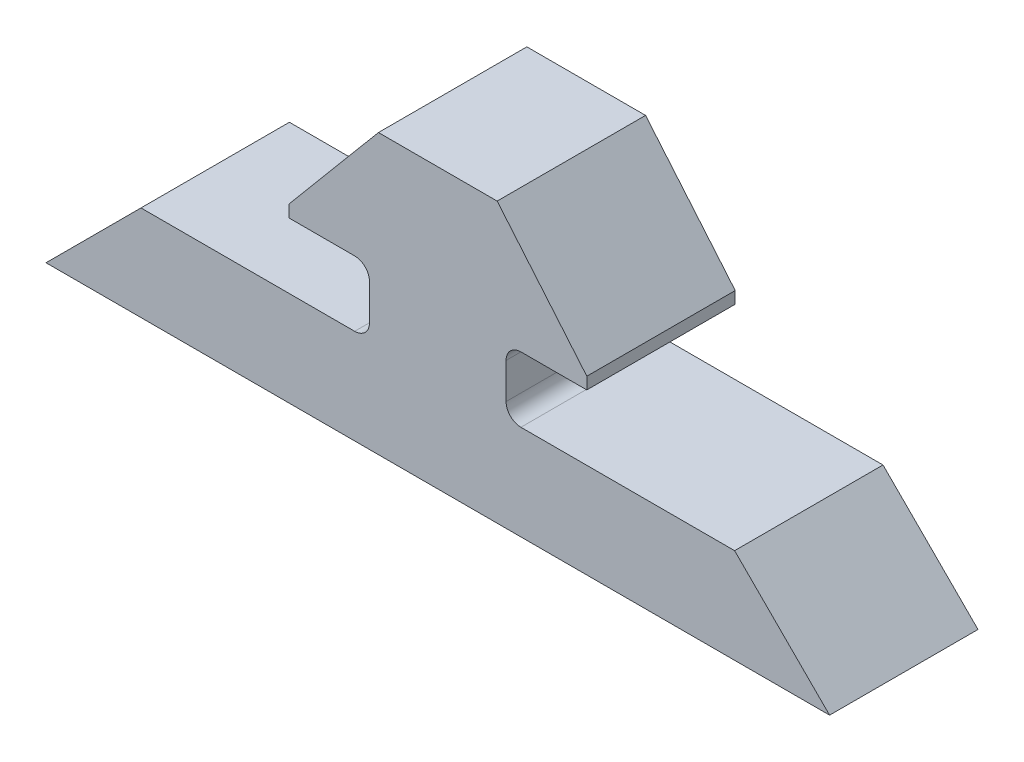
ISO-10303-21;
HEADER;
FILE_DESCRIPTION(('STEP AP214'),'2;1');
FILE_NAME('part.step','',(''),(''),'','','');
FILE_SCHEMA(('AUTOMOTIVE_DESIGN { 1 0 10303 214 1 1 1 1 }'));
ENDSEC;
DATA;
#1=APPLICATION_CONTEXT('core data for automotive mechanical design processes');
#2=APPLICATION_PROTOCOL_DEFINITION('international standard','automotive_design',2000,#1);
#3=PRODUCT_CONTEXT('',#1,'mechanical');
#4=PRODUCT('Part','Part','',(#3));
#5=PRODUCT_RELATED_PRODUCT_CATEGORY('part','',(#4));
#6=PRODUCT_DEFINITION_FORMATION('','',#4);
#7=PRODUCT_DEFINITION_CONTEXT('part definition',#1,'design');
#8=PRODUCT_DEFINITION('design','',#6,#7);
#9=PRODUCT_DEFINITION_SHAPE('','',#8);
#10=(LENGTH_UNIT() NAMED_UNIT(*) SI_UNIT(.MILLI.,.METRE.));
#11=(NAMED_UNIT(*) PLANE_ANGLE_UNIT() SI_UNIT($,.RADIAN.));
#12=(NAMED_UNIT(*) SI_UNIT($,.STERADIAN.) SOLID_ANGLE_UNIT());
#13=UNCERTAINTY_MEASURE_WITH_UNIT(LENGTH_MEASURE(1.E-05),#10,'distance_accuracy_value','');
#14=(GEOMETRIC_REPRESENTATION_CONTEXT(3) GLOBAL_UNCERTAINTY_ASSIGNED_CONTEXT((#13)) GLOBAL_UNIT_ASSIGNED_CONTEXT((#10,
#11,#12)) REPRESENTATION_CONTEXT('',''));
#15=CARTESIAN_POINT('',(0.,0.,0.));
#16=DIRECTION('',(0.,0.,1.));
#17=DIRECTION('',(1.,0.,0.));
#18=AXIS2_PLACEMENT_3D('',#15,#16,#17);
#19=CARTESIAN_POINT('',(-12.7,4.064,-3689.35));
#20=DIRECTION('',(0.707106781186539,-0.707106781186556,0.));
#21=DIRECTION('',(0.707106781186556,0.707106781186539,0.));
#22=AXIS2_PLACEMENT_3D('',#19,#20,#21);
#23=PLANE('',#22);
#24=DIRECTION('',(0.707106781186556,0.707106781186539,0.));
#25=VECTOR('',#24,1.);
#26=CARTESIAN_POINT('',(-12.7,4.064,-3683.));
#27=LINE('',#26,#25);
#28=CARTESIAN_POINT('',(-16.7640000000001,0.,-3683.));
#29=VERTEX_POINT('',#28);
#30=CARTESIAN_POINT('',(-12.7,4.064,-3683.));
#31=VERTEX_POINT('',#30);
#32=EDGE_CURVE('E190',#29,#31,#27,.T.);
#33=ORIENTED_EDGE('',*,*,#32,.T.);
#34=DIRECTION('',(0.,0.,1.));
#35=VECTOR('',#34,1.);
#36=CARTESIAN_POINT('',(-12.7,4.064,-3689.35));
#37=LINE('',#36,#35);
#38=CARTESIAN_POINT('',(-12.7,4.064,-3689.35));
#39=VERTEX_POINT('',#38);
#40=EDGE_CURVE('E11',#39,#31,#37,.T.);
#41=ORIENTED_EDGE('',*,*,#40,.F.);
#42=DIRECTION('',(0.707106781186556,0.707106781186539,0.));
#43=VECTOR('',#42,1.);
#44=CARTESIAN_POINT('',(-12.7,4.064,-3689.35));
#45=LINE('',#44,#43);
#46=CARTESIAN_POINT('',(-16.7640000000001,0.,-3689.35));
#47=VERTEX_POINT('',#46);
#48=EDGE_CURVE('E225',#47,#39,#45,.T.);
#49=ORIENTED_EDGE('',*,*,#48,.F.);
#50=DIRECTION('',(0.,0.,1.));
#51=VECTOR('',#50,1.);
#52=CARTESIAN_POINT('',(-16.7640000000001,0.,-3689.35));
#53=LINE('',#52,#51);
#54=EDGE_CURVE('E186',#47,#29,#53,.T.);
#55=ORIENTED_EDGE('',*,*,#54,.T.);
#56=EDGE_LOOP('',(#33,#41,#49,#55));
#57=FACE_BOUND('',#56,.T.);
#58=ADVANCED_FACE('F33',(#57),#23,.F.);
#59=CARTESIAN_POINT('',(-12.7,4.064,-3689.35));
#60=DIRECTION('',(0.,-1.,0.));
#61=DIRECTION('',(0.,0.,-1.));
#62=AXIS2_PLACEMENT_3D('',#59,#60,#61);
#63=PLANE('',#62);
#64=DIRECTION('',(1.,0.,0.));
#65=VECTOR('',#64,1.);
#66=CARTESIAN_POINT('',(-12.7,4.064,-3683.));
#67=LINE('',#66,#65);
#68=CARTESIAN_POINT('',(-3.55599999999985,4.064,-3683.));
#69=VERTEX_POINT('',#68);
#70=EDGE_CURVE('E193',#31,#69,#67,.T.);
#71=ORIENTED_EDGE('',*,*,#70,.T.);
#72=DIRECTION('',(0.,0.,1.));
#73=VECTOR('',#72,1.);
#74=CARTESIAN_POINT('',(-3.55599999999985,4.064,-3689.35));
#75=LINE('',#74,#73);
#76=CARTESIAN_POINT('',(-3.55599999999985,4.064,-3689.35));
#77=VERTEX_POINT('',#76);
#78=EDGE_CURVE('E41',#77,#69,#75,.T.);
#79=ORIENTED_EDGE('',*,*,#78,.F.);
#80=DIRECTION('',(1.,0.,0.));
#81=VECTOR('',#80,1.);
#82=CARTESIAN_POINT('',(-12.7,4.064,-3689.35));
#83=LINE('',#82,#81);
#84=EDGE_CURVE('E120',#39,#77,#83,.T.);
#85=ORIENTED_EDGE('',*,*,#84,.F.);
#86=ORIENTED_EDGE('',*,*,#40,.T.);
#87=EDGE_LOOP('',(#71,#79,#85,#86));
#88=FACE_BOUND('',#87,.T.);
#89=ADVANCED_FACE('F323',(#88),#63,.F.);
#90=CARTESIAN_POINT('',(-3.55599999999985,4.69899999999985,-3689.35));
#91=DIRECTION('',(0.,0.,1.));
#92=DIRECTION('',(1.,0.,0.));
#93=AXIS2_PLACEMENT_3D('',#90,#91,#92);
#94=CYLINDRICAL_SURFACE('',#93,0.634999999999851);
#95=CARTESIAN_POINT('',(-3.55599999999985,4.69899999999985,-3683.));
#96=DIRECTION('',(0.,0.,1.));
#97=DIRECTION('',(1.,0.,0.));
#98=AXIS2_PLACEMENT_3D('',#95,#96,#97);
#99=CIRCLE('',#98,0.634999999999851);
#100=CARTESIAN_POINT('',(-2.921,4.69899999999985,-3683.));
#101=VERTEX_POINT('',#100);
#102=EDGE_CURVE('E195',#69,#101,#99,.T.);
#103=ORIENTED_EDGE('',*,*,#102,.T.);
#104=DIRECTION('',(0.,0.,1.));
#105=VECTOR('',#104,1.);
#106=CARTESIAN_POINT('',(-2.921,4.69899999999985,-3689.35));
#107=LINE('',#106,#105);
#108=CARTESIAN_POINT('',(-2.921,4.69899999999985,-3689.35));
#109=VERTEX_POINT('',#108);
#110=EDGE_CURVE('E262',#109,#101,#107,.T.);
#111=ORIENTED_EDGE('',*,*,#110,.F.);
#112=CARTESIAN_POINT('',(-3.55599999999985,4.69899999999985,-3689.35));
#113=DIRECTION('',(0.,0.,1.));
#114=DIRECTION('',(1.,0.,0.));
#115=AXIS2_PLACEMENT_3D('',#112,#113,#114);
#116=CIRCLE('',#115,0.634999999999851);
#117=EDGE_CURVE('E270',#77,#109,#116,.T.);
#118=ORIENTED_EDGE('',*,*,#117,.F.);
#119=ORIENTED_EDGE('',*,*,#78,.T.);
#120=EDGE_LOOP('',(#103,#111,#118,#119));
#121=FACE_BOUND('',#120,.T.);
#122=ADVANCED_FACE('F268',(#121),#94,.F.);
#123=CARTESIAN_POINT('',(-2.92099999999999,4.69899999999985,-3689.35));
#124=DIRECTION('',(1.,0.,0.));
#125=DIRECTION('',(0.,1.,0.));
#126=AXIS2_PLACEMENT_3D('',#123,#124,#125);
#127=PLANE('',#126);
#128=DIRECTION('',(0.,1.,0.));
#129=VECTOR('',#128,1.);
#130=CARTESIAN_POINT('',(-2.92099999999999,4.69899999999985,-3683.));
#131=LINE('',#130,#129);
#132=CARTESIAN_POINT('',(-2.921,6.22300000000015,-3683.));
#133=VERTEX_POINT('',#132);
#134=EDGE_CURVE('E197',#101,#133,#131,.T.);
#135=ORIENTED_EDGE('',*,*,#134,.T.);
#136=DIRECTION('',(0.,0.,1.));
#137=VECTOR('',#136,1.);
#138=CARTESIAN_POINT('',(-2.921,6.22300000000015,-3689.35));
#139=LINE('',#138,#137);
#140=CARTESIAN_POINT('',(-2.921,6.22300000000015,-3689.35));
#141=VERTEX_POINT('',#140);
#142=EDGE_CURVE('E259',#141,#133,#139,.T.);
#143=ORIENTED_EDGE('',*,*,#142,.F.);
#144=DIRECTION('',(0.,1.,0.));
#145=VECTOR('',#144,1.);
#146=CARTESIAN_POINT('',(-2.92099999999999,4.69899999999985,-3689.35));
#147=LINE('',#146,#145);
#148=EDGE_CURVE('E286',#109,#141,#147,.T.);
#149=ORIENTED_EDGE('',*,*,#148,.F.);
#150=ORIENTED_EDGE('',*,*,#110,.T.);
#151=EDGE_LOOP('',(#135,#143,#149,#150));
#152=FACE_BOUND('',#151,.T.);
#153=ADVANCED_FACE('F277',(#152),#127,.F.);
#154=CARTESIAN_POINT('',(-3.55599999999985,6.22300000000015,-3689.35));
#155=DIRECTION('',(0.,0.,1.));
#156=DIRECTION('',(1.,0.,0.));
#157=AXIS2_PLACEMENT_3D('',#154,#155,#156);
#158=CYLINDRICAL_SURFACE('',#157,0.634999999999851);
#159=CARTESIAN_POINT('',(-3.55599999999985,6.22300000000015,-3683.));
#160=DIRECTION('',(0.,0.,1.));
#161=DIRECTION('',(1.,0.,0.));
#162=AXIS2_PLACEMENT_3D('',#159,#160,#161);
#163=CIRCLE('',#162,0.634999999999851);
#164=CARTESIAN_POINT('',(-3.55599999999985,6.858,-3683.));
#165=VERTEX_POINT('',#164);
#166=EDGE_CURVE('E199',#133,#165,#163,.T.);
#167=ORIENTED_EDGE('',*,*,#166,.T.);
#168=DIRECTION('',(0.,0.,1.));
#169=VECTOR('',#168,1.);
#170=CARTESIAN_POINT('',(-3.55599999999985,6.858,-3689.35));
#171=LINE('',#170,#169);
#172=CARTESIAN_POINT('',(-3.55599999999985,6.858,-3689.35));
#173=VERTEX_POINT('',#172);
#174=EDGE_CURVE('E256',#173,#165,#171,.T.);
#175=ORIENTED_EDGE('',*,*,#174,.F.);
#176=CARTESIAN_POINT('',(-3.55599999999985,6.22300000000015,-3689.35));
#177=DIRECTION('',(0.,0.,1.));
#178=DIRECTION('',(1.,0.,0.));
#179=AXIS2_PLACEMENT_3D('',#176,#177,#178);
#180=CIRCLE('',#179,0.634999999999851);
#181=EDGE_CURVE('E283',#141,#173,#180,.T.);
#182=ORIENTED_EDGE('',*,*,#181,.F.);
#183=ORIENTED_EDGE('',*,*,#142,.T.);
#184=EDGE_LOOP('',(#167,#175,#182,#183));
#185=FACE_BOUND('',#184,.T.);
#186=ADVANCED_FACE('F281',(#185),#158,.F.);
#187=CARTESIAN_POINT('',(-3.55599999999985,6.85800000000001,-3689.35));
#188=DIRECTION('',(0.,1.,0.));
#189=DIRECTION('',(-1.,0.,0.));
#190=AXIS2_PLACEMENT_3D('',#187,#188,#189);
#191=PLANE('',#190);
#192=DIRECTION('',(-1.,0.,0.));
#193=VECTOR('',#192,1.);
#194=CARTESIAN_POINT('',(-3.55599999999985,6.85800000000001,-3683.));
#195=LINE('',#194,#193);
#196=CARTESIAN_POINT('',(-6.376363549,6.858,-3683.));
#197=VERTEX_POINT('',#196);
#198=EDGE_CURVE('E201',#165,#197,#195,.T.);
#199=ORIENTED_EDGE('',*,*,#198,.T.);
#200=DIRECTION('',(0.,0.,1.));
#201=VECTOR('',#200,1.);
#202=CARTESIAN_POINT('',(-6.376363549,6.858,-3689.35));
#203=LINE('',#202,#201);
#204=CARTESIAN_POINT('',(-6.376363549,6.858,-3689.35));
#205=VERTEX_POINT('',#204);
#206=EDGE_CURVE('E253',#205,#197,#203,.T.);
#207=ORIENTED_EDGE('',*,*,#206,.F.);
#208=DIRECTION('',(-1.,0.,0.));
#209=VECTOR('',#208,1.);
#210=CARTESIAN_POINT('',(-3.55599999999985,6.85800000000001,-3689.35));
#211=LINE('',#210,#209);
#212=EDGE_CURVE('E285',#173,#205,#211,.T.);
#213=ORIENTED_EDGE('',*,*,#212,.F.);
#214=ORIENTED_EDGE('',*,*,#174,.T.);
#215=EDGE_LOOP('',(#199,#207,#213,#214));
#216=FACE_BOUND('',#215,.T.);
#217=ADVANCED_FACE('F335',(#216),#191,.F.);
#218=CARTESIAN_POINT('',(-6.376363549,6.858,-3689.35));
#219=DIRECTION('',(1.,0.,0.));
#220=DIRECTION('',(0.,0.,-1.));
#221=AXIS2_PLACEMENT_3D('',#218,#219,#220);
#222=PLANE('',#221);
#223=DIRECTION('',(0.,1.,0.));
#224=VECTOR('',#223,1.);
#225=CARTESIAN_POINT('',(-6.376363549,6.858,-3683.));
#226=LINE('',#225,#224);
#227=CARTESIAN_POINT('',(-6.376363549,7.36599995798179,-3683.));
#228=VERTEX_POINT('',#227);
#229=EDGE_CURVE('E203',#197,#228,#226,.T.);
#230=ORIENTED_EDGE('',*,*,#229,.T.);
#231=DIRECTION('',(0.,0.,1.));
#232=VECTOR('',#231,1.);
#233=CARTESIAN_POINT('',(-6.376363549,7.36599995798179,-3689.35));
#234=LINE('',#233,#232);
#235=CARTESIAN_POINT('',(-6.376363549,7.36599995798179,-3689.35));
#236=VERTEX_POINT('',#235);
#237=EDGE_CURVE('E250',#236,#228,#234,.T.);
#238=ORIENTED_EDGE('',*,*,#237,.F.);
#239=DIRECTION('',(0.,1.,0.));
#240=VECTOR('',#239,1.);
#241=CARTESIAN_POINT('',(-6.376363549,6.858,-3689.35));
#242=LINE('',#241,#240);
#243=EDGE_CURVE('E288',#205,#236,#242,.T.);
#244=ORIENTED_EDGE('',*,*,#243,.F.);
#245=ORIENTED_EDGE('',*,*,#206,.T.);
#246=EDGE_LOOP('',(#230,#238,#244,#245));
#247=FACE_BOUND('',#246,.T.);
#248=ADVANCED_FACE('F338',(#247),#222,.F.);
#249=CARTESIAN_POINT('',(-6.376363549,7.36599995798179,-3689.35));
#250=DIRECTION('',(0.766044443118977,-0.642787609686541,0.));
#251=DIRECTION('',(0.642787609686541,0.766044443118977,0.));
#252=AXIS2_PLACEMENT_3D('',#249,#250,#251);
#253=PLANE('',#252);
#254=DIRECTION('',(0.642787609686541,0.766044443118977,0.));
#255=VECTOR('',#254,1.);
#256=CARTESIAN_POINT('',(-6.376363549,7.36599995798179,-3683.));
#257=LINE('',#256,#255);
#258=CARTESIAN_POINT('',(-2.54,11.938,-3683.));
#259=VERTEX_POINT('',#258);
#260=EDGE_CURVE('E205',#228,#259,#257,.T.);
#261=ORIENTED_EDGE('',*,*,#260,.T.);
#262=DIRECTION('',(0.,0.,1.));
#263=VECTOR('',#262,1.);
#264=CARTESIAN_POINT('',(-2.54,11.938,-3689.35));
#265=LINE('',#264,#263);
#266=CARTESIAN_POINT('',(-2.54,11.938,-3689.35));
#267=VERTEX_POINT('',#266);
#268=EDGE_CURVE('E247',#267,#259,#265,.T.);
#269=ORIENTED_EDGE('',*,*,#268,.F.);
#270=DIRECTION('',(0.642787609686541,0.766044443118977,0.));
#271=VECTOR('',#270,1.);
#272=CARTESIAN_POINT('',(-6.376363549,7.36599995798179,-3689.35));
#273=LINE('',#272,#271);
#274=EDGE_CURVE('E294',#236,#267,#273,.T.);
#275=ORIENTED_EDGE('',*,*,#274,.F.);
#276=ORIENTED_EDGE('',*,*,#237,.T.);
#277=EDGE_LOOP('',(#261,#269,#275,#276));
#278=FACE_BOUND('',#277,.T.);
#279=ADVANCED_FACE('F342',(#278),#253,.F.);
#280=CARTESIAN_POINT('',(-2.54,11.938,-3689.35));
#281=DIRECTION('',(0.,-1.,0.));
#282=DIRECTION('',(0.,0.,-1.));
#283=AXIS2_PLACEMENT_3D('',#280,#281,#282);
#284=PLANE('',#283);
#285=DIRECTION('',(1.,0.,0.));
#286=VECTOR('',#285,1.);
#287=CARTESIAN_POINT('',(-2.54,11.938,-3683.));
#288=LINE('',#287,#286);
#289=CARTESIAN_POINT('',(2.54,11.938,-3683.));
#290=VERTEX_POINT('',#289);
#291=EDGE_CURVE('E207',#259,#290,#288,.T.);
#292=ORIENTED_EDGE('',*,*,#291,.T.);
#293=DIRECTION('',(0.,0.,1.));
#294=VECTOR('',#293,1.);
#295=CARTESIAN_POINT('',(2.54,11.938,-3689.35));
#296=LINE('',#295,#294);
#297=CARTESIAN_POINT('',(2.54,11.938,-3689.35));
#298=VERTEX_POINT('',#297);
#299=EDGE_CURVE('E244',#298,#290,#296,.T.);
#300=ORIENTED_EDGE('',*,*,#299,.F.);
#301=DIRECTION('',(1.,0.,0.));
#302=VECTOR('',#301,1.);
#303=CARTESIAN_POINT('',(-2.54,11.938,-3689.35));
#304=LINE('',#303,#302);
#305=EDGE_CURVE('E296',#267,#298,#304,.T.);
#306=ORIENTED_EDGE('',*,*,#305,.F.);
#307=ORIENTED_EDGE('',*,*,#268,.T.);
#308=EDGE_LOOP('',(#292,#300,#306,#307));
#309=FACE_BOUND('',#308,.T.);
#310=ADVANCED_FACE('F346',(#309),#284,.F.);
#311=CARTESIAN_POINT('',(2.54,11.938,-3689.35));
#312=DIRECTION('',(-0.766044443118977,-0.642787609686541,0.));
#313=DIRECTION('',(0.642787609686541,-0.766044443118977,0.));
#314=AXIS2_PLACEMENT_3D('',#311,#312,#313);
#315=PLANE('',#314);
#316=DIRECTION('',(0.642787609686541,-0.766044443118977,0.));
#317=VECTOR('',#316,1.);
#318=CARTESIAN_POINT('',(2.54,11.938,-3683.));
#319=LINE('',#318,#317);
#320=CARTESIAN_POINT('',(6.376363549,7.36599995798179,-3683.));
#321=VERTEX_POINT('',#320);
#322=EDGE_CURVE('E209',#290,#321,#319,.T.);
#323=ORIENTED_EDGE('',*,*,#322,.T.);
#324=DIRECTION('',(0.,0.,1.));
#325=VECTOR('',#324,1.);
#326=CARTESIAN_POINT('',(6.376363549,7.36599995798179,-3689.35));
#327=LINE('',#326,#325);
#328=CARTESIAN_POINT('',(6.376363549,7.36599995798179,-3689.35));
#329=VERTEX_POINT('',#328);
#330=EDGE_CURVE('E241',#329,#321,#327,.T.);
#331=ORIENTED_EDGE('',*,*,#330,.F.);
#332=DIRECTION('',(0.642787609686541,-0.766044443118977,0.));
#333=VECTOR('',#332,1.);
#334=CARTESIAN_POINT('',(2.54,11.938,-3689.35));
#335=LINE('',#334,#333);
#336=EDGE_CURVE('E298',#298,#329,#335,.T.);
#337=ORIENTED_EDGE('',*,*,#336,.F.);
#338=ORIENTED_EDGE('',*,*,#299,.T.);
#339=EDGE_LOOP('',(#323,#331,#337,#338));
#340=FACE_BOUND('',#339,.T.);
#341=ADVANCED_FACE('F350',(#340),#315,.F.);
#342=CARTESIAN_POINT('',(6.376363549,7.36599995798179,-3689.35));
#343=DIRECTION('',(-1.,0.,0.));
#344=DIRECTION('',(0.,0.,1.));
#345=AXIS2_PLACEMENT_3D('',#342,#343,#344);
#346=PLANE('',#345);
#347=DIRECTION('',(0.,-1.,0.));
#348=VECTOR('',#347,1.);
#349=CARTESIAN_POINT('',(6.376363549,7.36599995798179,-3683.));
#350=LINE('',#349,#348);
#351=CARTESIAN_POINT('',(6.376363549,6.858,-3683.));
#352=VERTEX_POINT('',#351);
#353=EDGE_CURVE('E211',#321,#352,#350,.T.);
#354=ORIENTED_EDGE('',*,*,#353,.T.);
#355=DIRECTION('',(0.,0.,1.));
#356=VECTOR('',#355,1.);
#357=CARTESIAN_POINT('',(6.376363549,6.858,-3689.35));
#358=LINE('',#357,#356);
#359=CARTESIAN_POINT('',(6.376363549,6.858,-3689.35));
#360=VERTEX_POINT('',#359);
#361=EDGE_CURVE('E238',#360,#352,#358,.T.);
#362=ORIENTED_EDGE('',*,*,#361,.F.);
#363=DIRECTION('',(0.,-1.,0.));
#364=VECTOR('',#363,1.);
#365=CARTESIAN_POINT('',(6.376363549,7.36599995798179,-3689.35));
#366=LINE('',#365,#364);
#367=EDGE_CURVE('E300',#329,#360,#366,.T.);
#368=ORIENTED_EDGE('',*,*,#367,.F.);
#369=ORIENTED_EDGE('',*,*,#330,.T.);
#370=EDGE_LOOP('',(#354,#362,#368,#369));
#371=FACE_BOUND('',#370,.T.);
#372=ADVANCED_FACE('F354',(#371),#346,.F.);
#373=CARTESIAN_POINT('',(6.376363549,6.858,-3689.35));
#374=DIRECTION('',(0.,1.,0.));
#375=DIRECTION('',(0.,0.,1.));
#376=AXIS2_PLACEMENT_3D('',#373,#374,#375);
#377=PLANE('',#376);
#378=DIRECTION('',(-1.,0.,0.));
#379=VECTOR('',#378,1.);
#380=CARTESIAN_POINT('',(6.376363549,6.858,-3683.));
#381=LINE('',#380,#379);
#382=CARTESIAN_POINT('',(3.55599999999985,6.858,-3683.));
#383=VERTEX_POINT('',#382);
#384=EDGE_CURVE('E213',#352,#383,#381,.T.);
#385=ORIENTED_EDGE('',*,*,#384,.T.);
#386=DIRECTION('',(0.,0.,1.));
#387=VECTOR('',#386,1.);
#388=CARTESIAN_POINT('',(3.55599999999985,6.858,-3689.35));
#389=LINE('',#388,#387);
#390=CARTESIAN_POINT('',(3.55599999999985,6.858,-3689.35));
#391=VERTEX_POINT('',#390);
#392=EDGE_CURVE('E235',#391,#383,#389,.T.);
#393=ORIENTED_EDGE('',*,*,#392,.F.);
#394=DIRECTION('',(-1.,0.,0.));
#395=VECTOR('',#394,1.);
#396=CARTESIAN_POINT('',(6.376363549,6.858,-3689.35));
#397=LINE('',#396,#395);
#398=EDGE_CURVE('E302',#360,#391,#397,.T.);
#399=ORIENTED_EDGE('',*,*,#398,.F.);
#400=ORIENTED_EDGE('',*,*,#361,.T.);
#401=EDGE_LOOP('',(#385,#393,#399,#400));
#402=FACE_BOUND('',#401,.T.);
#403=ADVANCED_FACE('F358',(#402),#377,.F.);
#404=CARTESIAN_POINT('',(3.55599999999985,6.22300000000015,-3689.35));
#405=DIRECTION('',(0.,0.,1.));
#406=DIRECTION('',(1.,0.,0.));
#407=AXIS2_PLACEMENT_3D('',#404,#405,#406);
#408=CYLINDRICAL_SURFACE('',#407,0.634999999999851);
#409=CARTESIAN_POINT('',(3.55599999999985,6.22300000000015,-3683.));
#410=DIRECTION('',(0.,0.,1.));
#411=DIRECTION('',(1.,0.,0.));
#412=AXIS2_PLACEMENT_3D('',#409,#410,#411);
#413=CIRCLE('',#412,0.634999999999851);
#414=CARTESIAN_POINT('',(2.921,6.22300000000015,-3683.));
#415=VERTEX_POINT('',#414);
#416=EDGE_CURVE('E215',#383,#415,#413,.T.);
#417=ORIENTED_EDGE('',*,*,#416,.T.);
#418=DIRECTION('',(0.,0.,1.));
#419=VECTOR('',#418,1.);
#420=CARTESIAN_POINT('',(2.921,6.22300000000015,-3689.35));
#421=LINE('',#420,#419);
#422=CARTESIAN_POINT('',(2.921,6.22300000000015,-3689.35));
#423=VERTEX_POINT('',#422);
#424=EDGE_CURVE('E232',#423,#415,#421,.T.);
#425=ORIENTED_EDGE('',*,*,#424,.F.);
#426=CARTESIAN_POINT('',(3.55599999999985,6.22300000000015,-3689.35));
#427=DIRECTION('',(0.,0.,1.));
#428=DIRECTION('',(1.,0.,0.));
#429=AXIS2_PLACEMENT_3D('',#426,#427,#428);
#430=CIRCLE('',#429,0.634999999999851);
#431=EDGE_CURVE('E304',#391,#423,#430,.T.);
#432=ORIENTED_EDGE('',*,*,#431,.F.);
#433=ORIENTED_EDGE('',*,*,#392,.T.);
#434=EDGE_LOOP('',(#417,#425,#432,#433));
#435=FACE_BOUND('',#434,.T.);
#436=ADVANCED_FACE('F362',(#435),#408,.F.);
#437=CARTESIAN_POINT('',(2.92099999999999,6.22300000000015,-3689.35));
#438=DIRECTION('',(-1.,0.,0.));
#439=DIRECTION('',(0.,-1.,0.));
#440=AXIS2_PLACEMENT_3D('',#437,#438,#439);
#441=PLANE('',#440);
#442=DIRECTION('',(0.,-1.,0.));
#443=VECTOR('',#442,1.);
#444=CARTESIAN_POINT('',(2.92099999999999,6.22300000000015,-3683.));
#445=LINE('',#444,#443);
#446=CARTESIAN_POINT('',(2.921,4.69899999999985,-3683.));
#447=VERTEX_POINT('',#446);
#448=EDGE_CURVE('E217',#415,#447,#445,.T.);
#449=ORIENTED_EDGE('',*,*,#448,.T.);
#450=DIRECTION('',(0.,0.,1.));
#451=VECTOR('',#450,1.);
#452=CARTESIAN_POINT('',(2.921,4.69899999999985,-3689.35));
#453=LINE('',#452,#451);
#454=CARTESIAN_POINT('',(2.921,4.69899999999985,-3689.35));
#455=VERTEX_POINT('',#454);
#456=EDGE_CURVE('E229',#455,#447,#453,.T.);
#457=ORIENTED_EDGE('',*,*,#456,.F.);
#458=DIRECTION('',(0.,-1.,0.));
#459=VECTOR('',#458,1.);
#460=CARTESIAN_POINT('',(2.92099999999999,6.22300000000015,-3689.35));
#461=LINE('',#460,#459);
#462=EDGE_CURVE('E306',#423,#455,#461,.T.);
#463=ORIENTED_EDGE('',*,*,#462,.F.);
#464=ORIENTED_EDGE('',*,*,#424,.T.);
#465=EDGE_LOOP('',(#449,#457,#463,#464));
#466=FACE_BOUND('',#465,.T.);
#467=ADVANCED_FACE('F312',(#466),#441,.F.);
#468=CARTESIAN_POINT('',(3.55599999999985,4.69899999999985,-3689.35));
#469=DIRECTION('',(0.,0.,1.));
#470=DIRECTION('',(1.,0.,0.));
#471=AXIS2_PLACEMENT_3D('',#468,#469,#470);
#472=CYLINDRICAL_SURFACE('',#471,0.634999999999851);
#473=CARTESIAN_POINT('',(3.55599999999985,4.69899999999985,-3683.));
#474=DIRECTION('',(0.,0.,1.));
#475=DIRECTION('',(1.,0.,0.));
#476=AXIS2_PLACEMENT_3D('',#473,#474,#475);
#477=CIRCLE('',#476,0.634999999999851);
#478=CARTESIAN_POINT('',(3.55599999999985,4.064,-3683.));
#479=VERTEX_POINT('',#478);
#480=EDGE_CURVE('E219',#447,#479,#477,.T.);
#481=ORIENTED_EDGE('',*,*,#480,.T.);
#482=DIRECTION('',(0.,0.,1.));
#483=VECTOR('',#482,1.);
#484=CARTESIAN_POINT('',(3.55599999999985,4.064,-3689.35));
#485=LINE('',#484,#483);
#486=CARTESIAN_POINT('',(3.55599999999985,4.064,-3689.35));
#487=VERTEX_POINT('',#486);
#488=EDGE_CURVE('E181',#487,#479,#485,.T.);
#489=ORIENTED_EDGE('',*,*,#488,.F.);
#490=CARTESIAN_POINT('',(3.55599999999985,4.69899999999985,-3689.35));
#491=DIRECTION('',(0.,0.,1.));
#492=DIRECTION('',(1.,0.,0.));
#493=AXIS2_PLACEMENT_3D('',#490,#491,#492);
#494=CIRCLE('',#493,0.634999999999851);
#495=EDGE_CURVE('E170',#455,#487,#494,.T.);
#496=ORIENTED_EDGE('',*,*,#495,.F.);
#497=ORIENTED_EDGE('',*,*,#456,.T.);
#498=EDGE_LOOP('',(#481,#489,#496,#497));
#499=FACE_BOUND('',#498,.T.);
#500=ADVANCED_FACE('F316',(#499),#472,.F.);
#501=CARTESIAN_POINT('',(3.55599999999985,4.06399999999999,-3689.35));
#502=DIRECTION('',(0.,-1.,0.));
#503=DIRECTION('',(1.,0.,0.));
#504=AXIS2_PLACEMENT_3D('',#501,#502,#503);
#505=PLANE('',#504);
#506=DIRECTION('',(1.,0.,0.));
#507=VECTOR('',#506,1.);
#508=CARTESIAN_POINT('',(3.55599999999985,4.06399999999999,-3683.));
#509=LINE('',#508,#507);
#510=CARTESIAN_POINT('',(12.7,4.064,-3683.));
#511=VERTEX_POINT('',#510);
#512=EDGE_CURVE('E179',#479,#511,#509,.T.);
#513=ORIENTED_EDGE('',*,*,#512,.T.);
#514=DIRECTION('',(0.,0.,1.));
#515=VECTOR('',#514,1.);
#516=CARTESIAN_POINT('',(12.7,4.064,-3689.35));
#517=LINE('',#516,#515);
#518=CARTESIAN_POINT('',(12.7,4.064,-3689.35));
#519=VERTEX_POINT('',#518);
#520=EDGE_CURVE('E176',#519,#511,#517,.T.);
#521=ORIENTED_EDGE('',*,*,#520,.F.);
#522=DIRECTION('',(1.,0.,0.));
#523=VECTOR('',#522,1.);
#524=CARTESIAN_POINT('',(3.55599999999985,4.06399999999999,-3689.35));
#525=LINE('',#524,#523);
#526=EDGE_CURVE('E163',#487,#519,#525,.T.);
#527=ORIENTED_EDGE('',*,*,#526,.F.);
#528=ORIENTED_EDGE('',*,*,#488,.T.);
#529=EDGE_LOOP('',(#513,#521,#527,#528));
#530=FACE_BOUND('',#529,.T.);
#531=ADVANCED_FACE('F177',(#530),#505,.F.);
#532=CARTESIAN_POINT('',(12.7,4.064,-3689.35));
#533=DIRECTION('',(-0.707106781186547,-0.707106781186548,0.));
#534=DIRECTION('',(0.707106781186548,-0.707106781186547,0.));
#535=AXIS2_PLACEMENT_3D('',#532,#533,#534);
#536=PLANE('',#535);
#537=DIRECTION('',(0.707106781186548,-0.707106781186547,0.));
#538=VECTOR('',#537,1.);
#539=CARTESIAN_POINT('',(12.7,4.064,-3683.));
#540=LINE('',#539,#538);
#541=CARTESIAN_POINT('',(16.764,0.,-3683.));
#542=VERTEX_POINT('',#541);
#543=EDGE_CURVE('E222',#511,#542,#540,.T.);
#544=ORIENTED_EDGE('',*,*,#543,.T.);
#545=DIRECTION('',(0.,0.,1.));
#546=VECTOR('',#545,1.);
#547=CARTESIAN_POINT('',(16.764,0.,-3689.35));
#548=LINE('',#547,#546);
#549=CARTESIAN_POINT('',(16.764,0.,-3689.35));
#550=VERTEX_POINT('',#549);
#551=EDGE_CURVE('E182',#550,#542,#548,.T.);
#552=ORIENTED_EDGE('',*,*,#551,.F.);
#553=DIRECTION('',(0.707106781186548,-0.707106781186547,0.));
#554=VECTOR('',#553,1.);
#555=CARTESIAN_POINT('',(12.7,4.064,-3689.35));
#556=LINE('',#555,#554);
#557=EDGE_CURVE('E167',#519,#550,#556,.T.);
#558=ORIENTED_EDGE('',*,*,#557,.F.);
#559=ORIENTED_EDGE('',*,*,#520,.T.);
#560=EDGE_LOOP('',(#544,#552,#558,#559));
#561=FACE_BOUND('',#560,.T.);
#562=ADVANCED_FACE('F184',(#561),#536,.F.);
#563=CARTESIAN_POINT('',(-16.7640000000001,0.,-3689.35));
#564=DIRECTION('',(0.,1.,0.));
#565=DIRECTION('',(-1.,0.,0.));
#566=AXIS2_PLACEMENT_3D('',#563,#564,#565);
#567=PLANE('',#566);
#568=DIRECTION('',(-1.,0.,0.));
#569=VECTOR('',#568,1.);
#570=CARTESIAN_POINT('',(-16.7640000000001,0.,-3683.));
#571=LINE('',#570,#569);
#572=EDGE_CURVE('E108',#542,#29,#571,.T.);
#573=ORIENTED_EDGE('',*,*,#572,.T.);
#574=ORIENTED_EDGE('',*,*,#54,.F.);
#575=DIRECTION('',(-1.,0.,0.));
#576=VECTOR('',#575,1.);
#577=CARTESIAN_POINT('',(16.764,0.,-3689.35));
#578=LINE('',#577,#576);
#579=EDGE_CURVE('E49',#550,#47,#578,.T.);
#580=ORIENTED_EDGE('',*,*,#579,.F.);
#581=ORIENTED_EDGE('',*,*,#551,.T.);
#582=EDGE_LOOP('',(#573,#574,#580,#581));
#583=FACE_BOUND('',#582,.T.);
#584=ADVANCED_FACE('F317',(#583),#567,.F.);
#585=CARTESIAN_POINT('',(3.55599999999985,4.69899999999985,-3689.35));
#586=DIRECTION('',(0.,0.,1.));
#587=DIRECTION('',(1.,0.,0.));
#588=AXIS2_PLACEMENT_3D('',#585,#586,#587);
#589=PLANE('',#588);
#590=ORIENTED_EDGE('',*,*,#48,.T.);
#591=ORIENTED_EDGE('',*,*,#84,.T.);
#592=ORIENTED_EDGE('',*,*,#117,.T.);
#593=ORIENTED_EDGE('',*,*,#148,.T.);
#594=ORIENTED_EDGE('',*,*,#181,.T.);
#595=ORIENTED_EDGE('',*,*,#212,.T.);
#596=ORIENTED_EDGE('',*,*,#243,.T.);
#597=ORIENTED_EDGE('',*,*,#274,.T.);
#598=ORIENTED_EDGE('',*,*,#305,.T.);
#599=ORIENTED_EDGE('',*,*,#336,.T.);
#600=ORIENTED_EDGE('',*,*,#367,.T.);
#601=ORIENTED_EDGE('',*,*,#398,.T.);
#602=ORIENTED_EDGE('',*,*,#431,.T.);
#603=ORIENTED_EDGE('',*,*,#462,.T.);
#604=ORIENTED_EDGE('',*,*,#495,.T.);
#605=ORIENTED_EDGE('',*,*,#526,.T.);
#606=ORIENTED_EDGE('',*,*,#557,.T.);
#607=ORIENTED_EDGE('',*,*,#579,.T.);
#608=EDGE_LOOP('',(#590,#591,#592,#593,#594,#595,#596,#597,#598,#599,#600,#601,#602,#603,#604,
#605,#606,#607));
#609=FACE_BOUND('',#608,.T.);
#610=ADVANCED_FACE('F165',(#609),#589,.F.);
#611=CARTESIAN_POINT('',(3.55599999999985,4.69899999999985,-3683.));
#612=DIRECTION('',(0.,0.,1.));
#613=DIRECTION('',(1.,0.,0.));
#614=AXIS2_PLACEMENT_3D('',#611,#612,#613);
#615=PLANE('',#614);
#616=ORIENTED_EDGE('',*,*,#32,.F.);
#617=ORIENTED_EDGE('',*,*,#572,.F.);
#618=ORIENTED_EDGE('',*,*,#543,.F.);
#619=ORIENTED_EDGE('',*,*,#512,.F.);
#620=ORIENTED_EDGE('',*,*,#480,.F.);
#621=ORIENTED_EDGE('',*,*,#448,.F.);
#622=ORIENTED_EDGE('',*,*,#416,.F.);
#623=ORIENTED_EDGE('',*,*,#384,.F.);
#624=ORIENTED_EDGE('',*,*,#353,.F.);
#625=ORIENTED_EDGE('',*,*,#322,.F.);
#626=ORIENTED_EDGE('',*,*,#291,.F.);
#627=ORIENTED_EDGE('',*,*,#260,.F.);
#628=ORIENTED_EDGE('',*,*,#229,.F.);
#629=ORIENTED_EDGE('',*,*,#198,.F.);
#630=ORIENTED_EDGE('',*,*,#166,.F.);
#631=ORIENTED_EDGE('',*,*,#134,.F.);
#632=ORIENTED_EDGE('',*,*,#102,.F.);
#633=ORIENTED_EDGE('',*,*,#70,.F.);
#634=EDGE_LOOP('',(#616,#617,#618,#619,#620,#621,#622,#623,#624,#625,#626,#627,#628,#629,#630,
#631,#632,#633));
#635=FACE_BOUND('',#634,.T.);
#636=ADVANCED_FACE('F272',(#635),#615,.T.);
#637=CLOSED_SHELL('',(#58,#89,#122,#153,#186,#217,#248,#279,#310,#341,#372,#403,#436,#467,#500,
#531,#562,#584,#610,#636));
#638=MANIFOLD_SOLID_BREP('B2',#637);
#639=ADVANCED_BREP_SHAPE_REPRESENTATION('',(#18,#638),#14);
#640=SHAPE_DEFINITION_REPRESENTATION(#9,#639);
ENDSEC;
END-ISO-10303-21;
